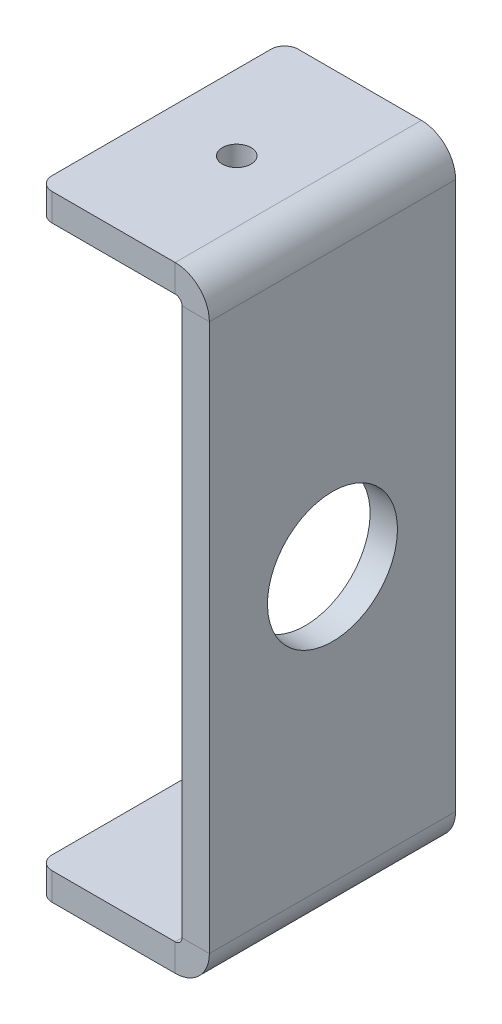
ISO-10303-21;
HEADER;
FILE_DESCRIPTION(('STEP AP214'),'2;1');
FILE_NAME('part.step','',(''),(''),'','','');
FILE_SCHEMA(('AUTOMOTIVE_DESIGN { 1 0 10303 214 1 1 1 1 }'));
ENDSEC;
DATA;
#1=APPLICATION_CONTEXT('core data for automotive mechanical design processes');
#2=APPLICATION_PROTOCOL_DEFINITION('international standard','automotive_design',2000,#1);
#3=PRODUCT_CONTEXT('',#1,'mechanical');
#4=PRODUCT('Part','Part','',(#3));
#5=PRODUCT_RELATED_PRODUCT_CATEGORY('part','',(#4));
#6=PRODUCT_DEFINITION_FORMATION('','',#4);
#7=PRODUCT_DEFINITION_CONTEXT('part definition',#1,'design');
#8=PRODUCT_DEFINITION('design','',#6,#7);
#9=PRODUCT_DEFINITION_SHAPE('','',#8);
#10=(LENGTH_UNIT() NAMED_UNIT(*) SI_UNIT(.MILLI.,.METRE.));
#11=(NAMED_UNIT(*) PLANE_ANGLE_UNIT() SI_UNIT($,.RADIAN.));
#12=(NAMED_UNIT(*) SI_UNIT($,.STERADIAN.) SOLID_ANGLE_UNIT());
#13=UNCERTAINTY_MEASURE_WITH_UNIT(LENGTH_MEASURE(1.E-05),#10,'distance_accuracy_value','');
#14=(GEOMETRIC_REPRESENTATION_CONTEXT(3) GLOBAL_UNCERTAINTY_ASSIGNED_CONTEXT((#13)) GLOBAL_UNIT_ASSIGNED_CONTEXT((#10,
#11,#12)) REPRESENTATION_CONTEXT('',''));
#15=CARTESIAN_POINT('',(0.,0.,0.));
#16=DIRECTION('',(0.,0.,1.));
#17=DIRECTION('',(1.,0.,0.));
#18=AXIS2_PLACEMENT_3D('',#15,#16,#17);
#19=CARTESIAN_POINT('',(0.,-45.,18.));
#20=DIRECTION('',(0.,1.,0.));
#21=DIRECTION('',(0.,0.,1.));
#22=AXIS2_PLACEMENT_3D('',#19,#20,#21);
#23=PLANE('',#22);
#24=DIRECTION('',(0.,0.,-1.));
#25=VECTOR('',#24,1.);
#26=CARTESIAN_POINT('',(-25.,-45.,18.));
#27=LINE('',#26,#25);
#28=CARTESIAN_POINT('',(-25.,-45.,16.));
#29=VERTEX_POINT('',#28);
#30=CARTESIAN_POINT('',(-25.,-45.,-16.));
#31=VERTEX_POINT('',#30);
#32=EDGE_CURVE('E244',#29,#31,#27,.T.);
#33=ORIENTED_EDGE('',*,*,#32,.T.);
#34=CARTESIAN_POINT('',(-23.,-45.,-16.));
#35=DIRECTION('',(0.,1.,0.));
#36=DIRECTION('',(0.,0.,1.));
#37=AXIS2_PLACEMENT_3D('',#34,#35,#36);
#38=CIRCLE('',#37,2.);
#39=CARTESIAN_POINT('',(-23.,-45.,-18.));
#40=VERTEX_POINT('',#39);
#41=EDGE_CURVE('E288',#31,#40,#38,.F.);
#42=ORIENTED_EDGE('',*,*,#41,.T.);
#43=DIRECTION('',(1.,0.,0.));
#44=VECTOR('',#43,1.);
#45=CARTESIAN_POINT('',(0.,-45.,-18.));
#46=LINE('',#45,#44);
#47=CARTESIAN_POINT('',(-4.99999999999999,-45.,-18.));
#48=VERTEX_POINT('',#47);
#49=EDGE_CURVE('E222',#40,#48,#46,.T.);
#50=ORIENTED_EDGE('',*,*,#49,.T.);
#51=DIRECTION('',(0.,0.,-1.));
#52=VECTOR('',#51,1.);
#53=CARTESIAN_POINT('',(-4.99999999999999,-45.,18.));
#54=LINE('',#53,#52);
#55=CARTESIAN_POINT('',(-4.99999999999999,-45.,18.));
#56=VERTEX_POINT('',#55);
#57=EDGE_CURVE('E241',#56,#48,#54,.T.);
#58=ORIENTED_EDGE('',*,*,#57,.F.);
#59=DIRECTION('',(1.,0.,0.));
#60=VECTOR('',#59,1.);
#61=CARTESIAN_POINT('',(0.,-45.,18.));
#62=LINE('',#61,#60);
#63=CARTESIAN_POINT('',(-23.,-45.,18.));
#64=VERTEX_POINT('',#63);
#65=EDGE_CURVE('E197',#64,#56,#62,.T.);
#66=ORIENTED_EDGE('',*,*,#65,.F.);
#67=CARTESIAN_POINT('',(-23.,-45.,16.));
#68=DIRECTION('',(0.,1.,0.));
#69=DIRECTION('',(0.,0.,1.));
#70=AXIS2_PLACEMENT_3D('',#67,#68,#69);
#71=CIRCLE('',#70,2.);
#72=EDGE_CURVE('E286',#64,#29,#71,.F.);
#73=ORIENTED_EDGE('',*,*,#72,.T.);
#74=EDGE_LOOP('',(#33,#42,#50,#58,#66,#73));
#75=FACE_BOUND('',#74,.T.);
#76=CARTESIAN_POINT('',(-14.,-45.,0.));
#77=DIRECTION('',(0.,-1.,0.));
#78=DIRECTION('',(0.,0.,-1.));
#79=AXIS2_PLACEMENT_3D('',#76,#77,#78);
#80=CIRCLE('',#79,2.1);
#81=CARTESIAN_POINT('',(-14.,-45.,-2.1));
#82=VERTEX_POINT('',#81);
#83=EDGE_CURVE('E328',#82,#82,#80,.T.);
#84=ORIENTED_EDGE('',*,*,#83,.F.);
#85=EDGE_LOOP('',(#84));
#86=FACE_BOUND('',#85,.T.);
#87=ADVANCED_FACE('F39',(#75,#86),#23,.F.);
#88=CARTESIAN_POINT('',(0.,45.,18.));
#89=DIRECTION('',(0.,-1.,0.));
#90=DIRECTION('',(0.,0.,-1.));
#91=AXIS2_PLACEMENT_3D('',#88,#89,#90);
#92=PLANE('',#91);
#93=DIRECTION('',(-1.,0.,0.));
#94=VECTOR('',#93,1.);
#95=CARTESIAN_POINT('',(0.,45.,-18.));
#96=LINE('',#95,#94);
#97=CARTESIAN_POINT('',(-4.99999999999999,45.,-18.));
#98=VERTEX_POINT('',#97);
#99=CARTESIAN_POINT('',(-23.,45.,-18.));
#100=VERTEX_POINT('',#99);
#101=EDGE_CURVE('E207',#98,#100,#96,.T.);
#102=ORIENTED_EDGE('',*,*,#101,.T.);
#103=CARTESIAN_POINT('',(-23.,45.,-16.));
#104=DIRECTION('',(0.,-1.,0.));
#105=DIRECTION('',(0.,0.,-1.));
#106=AXIS2_PLACEMENT_3D('',#103,#104,#105);
#107=CIRCLE('',#106,2.);
#108=CARTESIAN_POINT('',(-25.,45.,-16.));
#109=VERTEX_POINT('',#108);
#110=EDGE_CURVE('E297',#100,#109,#107,.F.);
#111=ORIENTED_EDGE('',*,*,#110,.T.);
#112=DIRECTION('',(0.,0.,-1.));
#113=VECTOR('',#112,1.);
#114=CARTESIAN_POINT('',(-25.,45.,18.));
#115=LINE('',#114,#113);
#116=CARTESIAN_POINT('',(-25.,45.,16.));
#117=VERTEX_POINT('',#116);
#118=EDGE_CURVE('E258',#117,#109,#115,.T.);
#119=ORIENTED_EDGE('',*,*,#118,.F.);
#120=CARTESIAN_POINT('',(-23.,45.,16.));
#121=DIRECTION('',(0.,-1.,0.));
#122=DIRECTION('',(0.,0.,-1.));
#123=AXIS2_PLACEMENT_3D('',#120,#121,#122);
#124=CIRCLE('',#123,2.);
#125=CARTESIAN_POINT('',(-23.,45.,18.));
#126=VERTEX_POINT('',#125);
#127=EDGE_CURVE('E295',#117,#126,#124,.F.);
#128=ORIENTED_EDGE('',*,*,#127,.T.);
#129=DIRECTION('',(-1.,0.,0.));
#130=VECTOR('',#129,1.);
#131=CARTESIAN_POINT('',(0.,45.,18.));
#132=LINE('',#131,#130);
#133=CARTESIAN_POINT('',(-4.99999999999999,45.,18.));
#134=VERTEX_POINT('',#133);
#135=EDGE_CURVE('E182',#134,#126,#132,.T.);
#136=ORIENTED_EDGE('',*,*,#135,.F.);
#137=DIRECTION('',(0.,0.,-1.));
#138=VECTOR('',#137,1.);
#139=CARTESIAN_POINT('',(-4.99999999999999,45.,18.));
#140=LINE('',#139,#138);
#141=EDGE_CURVE('E206',#134,#98,#140,.T.);
#142=ORIENTED_EDGE('',*,*,#141,.T.);
#143=EDGE_LOOP('',(#102,#111,#119,#128,#136,#142));
#144=FACE_BOUND('',#143,.T.);
#145=CARTESIAN_POINT('',(-14.,45.,0.));
#146=DIRECTION('',(0.,1.,0.));
#147=DIRECTION('',(0.,0.,1.));
#148=AXIS2_PLACEMENT_3D('',#145,#146,#147);
#149=CIRCLE('',#148,2.1);
#150=CARTESIAN_POINT('',(-14.,45.,2.1));
#151=VERTEX_POINT('',#150);
#152=EDGE_CURVE('E322',#151,#151,#149,.T.);
#153=ORIENTED_EDGE('',*,*,#152,.F.);
#154=EDGE_LOOP('',(#153));
#155=FACE_BOUND('',#154,.T.);
#156=ADVANCED_FACE('F313',(#144,#155),#92,.F.);
#157=CARTESIAN_POINT('',(-4.99999999999999,-45.,18.));
#158=DIRECTION('',(0.,0.,1.));
#159=DIRECTION('',(1.,0.,0.));
#160=AXIS2_PLACEMENT_3D('',#157,#158,#159);
#161=PLANE('',#160);
#162=DIRECTION('',(0.,1.,0.));
#163=VECTOR('',#162,1.);
#164=CARTESIAN_POINT('',(-4.99999999999999,-45.,18.));
#165=LINE('',#164,#163);
#166=CARTESIAN_POINT('',(-4.99999999999999,-41.,18.));
#167=VERTEX_POINT('',#166);
#168=EDGE_CURVE('E271',#56,#167,#165,.T.);
#169=ORIENTED_EDGE('',*,*,#168,.F.);
#170=CARTESIAN_POINT('',(-4.99999999999999,-40.,18.));
#171=DIRECTION('',(0.,0.,-1.));
#172=DIRECTION('',(-1.,0.,0.));
#173=AXIS2_PLACEMENT_3D('',#170,#171,#172);
#174=CIRCLE('',#173,5.);
#175=CARTESIAN_POINT('',(0.,-39.9999999999999,18.));
#176=VERTEX_POINT('',#175);
#177=EDGE_CURVE('E199',#56,#176,#174,.F.);
#178=ORIENTED_EDGE('',*,*,#177,.T.);
#179=DIRECTION('',(1.,0.,0.));
#180=VECTOR('',#179,1.);
#181=CARTESIAN_POINT('',(-3.99999999999999,-39.9999999999999,18.));
#182=LINE('',#181,#180);
#183=CARTESIAN_POINT('',(-3.99999999999999,-39.9999999999999,18.));
#184=VERTEX_POINT('',#183);
#185=EDGE_CURVE('E269',#184,#176,#182,.T.);
#186=ORIENTED_EDGE('',*,*,#185,.F.);
#187=CARTESIAN_POINT('',(-4.99999999999999,-40.,18.));
#188=DIRECTION('',(0.,0.,1.));
#189=DIRECTION('',(1.,0.,0.));
#190=AXIS2_PLACEMENT_3D('',#187,#188,#189);
#191=CIRCLE('',#190,1.);
#192=EDGE_CURVE('E189',#167,#184,#191,.T.);
#193=ORIENTED_EDGE('',*,*,#192,.F.);
#194=EDGE_LOOP('',(#169,#178,#186,#193));
#195=FACE_BOUND('',#194,.T.);
#196=ADVANCED_FACE('F372',(#195),#161,.T.);
#197=CARTESIAN_POINT('',(-3.99999999999999,-39.9999999999999,18.));
#198=DIRECTION('',(0.,0.,1.));
#199=DIRECTION('',(1.,0.,0.));
#200=AXIS2_PLACEMENT_3D('',#197,#198,#199);
#201=PLANE('',#200);
#202=DIRECTION('',(1.,0.,0.));
#203=VECTOR('',#202,1.);
#204=CARTESIAN_POINT('',(0.,-41.,18.));
#205=LINE('',#204,#203);
#206=CARTESIAN_POINT('',(-23.,-41.,18.));
#207=VERTEX_POINT('',#206);
#208=EDGE_CURVE('E195',#207,#167,#205,.T.);
#209=ORIENTED_EDGE('',*,*,#208,.F.);
#210=DIRECTION('',(0.,1.,0.));
#211=VECTOR('',#210,1.);
#212=CARTESIAN_POINT('',(-23.,-39.9999999999999,18.));
#213=LINE('',#212,#211);
#214=EDGE_CURVE('E290',#207,#64,#213,.F.);
#215=ORIENTED_EDGE('',*,*,#214,.T.);
#216=ORIENTED_EDGE('',*,*,#65,.T.);
#217=ORIENTED_EDGE('',*,*,#168,.T.);
#218=EDGE_LOOP('',(#209,#215,#216,#217));
#219=FACE_BOUND('',#218,.T.);
#220=ADVANCED_FACE('F650',(#219),#201,.T.);
#221=CARTESIAN_POINT('',(0.,-39.9999999999999,-18.));
#222=DIRECTION('',(0.,0.,-1.));
#223=DIRECTION('',(-1.,0.,0.));
#224=AXIS2_PLACEMENT_3D('',#221,#222,#223);
#225=PLANE('',#224);
#226=DIRECTION('',(-1.,0.,0.));
#227=VECTOR('',#226,1.);
#228=CARTESIAN_POINT('',(0.,-39.9999999999999,-18.));
#229=LINE('',#228,#227);
#230=CARTESIAN_POINT('',(0.,-39.9999999999999,-18.));
#231=VERTEX_POINT('',#230);
#232=CARTESIAN_POINT('',(-3.99999999999999,-39.9999999999999,-18.));
#233=VERTEX_POINT('',#232);
#234=EDGE_CURVE('E267',#231,#233,#229,.T.);
#235=ORIENTED_EDGE('',*,*,#234,.F.);
#236=CARTESIAN_POINT('',(-4.99999999999999,-40.,-18.));
#237=DIRECTION('',(0.,0.,-1.));
#238=DIRECTION('',(-1.,0.,0.));
#239=AXIS2_PLACEMENT_3D('',#236,#237,#238);
#240=CIRCLE('',#239,5.);
#241=EDGE_CURVE('E224',#48,#231,#240,.F.);
#242=ORIENTED_EDGE('',*,*,#241,.F.);
#243=DIRECTION('',(0.,-1.,0.));
#244=VECTOR('',#243,1.);
#245=CARTESIAN_POINT('',(-4.99999999999999,-41.,-18.));
#246=LINE('',#245,#244);
#247=CARTESIAN_POINT('',(-4.99999999999999,-41.,-18.));
#248=VERTEX_POINT('',#247);
#249=EDGE_CURVE('E264',#248,#48,#246,.T.);
#250=ORIENTED_EDGE('',*,*,#249,.F.);
#251=CARTESIAN_POINT('',(-4.99999999999999,-40.,-18.));
#252=DIRECTION('',(0.,0.,1.));
#253=DIRECTION('',(1.,0.,0.));
#254=AXIS2_PLACEMENT_3D('',#251,#252,#253);
#255=CIRCLE('',#254,1.);
#256=EDGE_CURVE('E217',#248,#233,#255,.T.);
#257=ORIENTED_EDGE('',*,*,#256,.T.);
#258=EDGE_LOOP('',(#235,#242,#250,#257));
#259=FACE_BOUND('',#258,.T.);
#260=ADVANCED_FACE('F364',(#259),#225,.T.);
#261=CARTESIAN_POINT('',(-4.99999999999999,-41.,-18.));
#262=DIRECTION('',(0.,0.,-1.));
#263=DIRECTION('',(-1.,0.,0.));
#264=AXIS2_PLACEMENT_3D('',#261,#262,#263);
#265=PLANE('',#264);
#266=DIRECTION('',(0.,1.,0.));
#267=VECTOR('',#266,1.);
#268=CARTESIAN_POINT('',(0.,45.,-18.));
#269=LINE('',#268,#267);
#270=CARTESIAN_POINT('',(0.,40.,-18.));
#271=VERTEX_POINT('',#270);
#272=EDGE_CURVE('E227',#231,#271,#269,.T.);
#273=ORIENTED_EDGE('',*,*,#272,.F.);
#274=ORIENTED_EDGE('',*,*,#234,.T.);
#275=DIRECTION('',(0.,1.,0.));
#276=VECTOR('',#275,1.);
#277=CARTESIAN_POINT('',(-3.99999999999999,45.,-18.));
#278=LINE('',#277,#276);
#279=CARTESIAN_POINT('',(-3.99999999999999,40.,-18.));
#280=VERTEX_POINT('',#279);
#281=EDGE_CURVE('E214',#233,#280,#278,.T.);
#282=ORIENTED_EDGE('',*,*,#281,.T.);
#283=DIRECTION('',(1.,0.,0.));
#284=VECTOR('',#283,1.);
#285=CARTESIAN_POINT('',(-3.99999999999999,40.,-18.));
#286=LINE('',#285,#284);
#287=EDGE_CURVE('E260',#280,#271,#286,.T.);
#288=ORIENTED_EDGE('',*,*,#287,.T.);
#289=EDGE_LOOP('',(#273,#274,#282,#288));
#290=FACE_BOUND('',#289,.T.);
#291=ADVANCED_FACE('F356',(#290),#265,.T.);
#292=CARTESIAN_POINT('',(0.,40.,18.));
#293=DIRECTION('',(0.,0.,1.));
#294=DIRECTION('',(1.,0.,0.));
#295=AXIS2_PLACEMENT_3D('',#292,#293,#294);
#296=PLANE('',#295);
#297=DIRECTION('',(-1.,0.,0.));
#298=VECTOR('',#297,1.);
#299=CARTESIAN_POINT('',(0.,40.,18.));
#300=LINE('',#299,#298);
#301=CARTESIAN_POINT('',(0.,40.,18.));
#302=VERTEX_POINT('',#301);
#303=CARTESIAN_POINT('',(-3.99999999999999,40.,18.));
#304=VERTEX_POINT('',#303);
#305=EDGE_CURVE('E163',#302,#304,#300,.T.);
#306=ORIENTED_EDGE('',*,*,#305,.F.);
#307=CARTESIAN_POINT('',(-4.99999999999999,40.,18.));
#308=DIRECTION('',(0.,0.,-1.));
#309=DIRECTION('',(-1.,0.,0.));
#310=AXIS2_PLACEMENT_3D('',#307,#308,#309);
#311=CIRCLE('',#310,5.);
#312=EDGE_CURVE('E161',#302,#134,#311,.F.);
#313=ORIENTED_EDGE('',*,*,#312,.T.);
#314=DIRECTION('',(0.,1.,0.));
#315=VECTOR('',#314,1.);
#316=CARTESIAN_POINT('',(-4.99999999999999,41.,18.));
#317=LINE('',#316,#315);
#318=CARTESIAN_POINT('',(-4.99999999999999,41.,18.));
#319=VERTEX_POINT('',#318);
#320=EDGE_CURVE('E154',#319,#134,#317,.T.);
#321=ORIENTED_EDGE('',*,*,#320,.F.);
#322=CARTESIAN_POINT('',(-4.99999999999999,40.,18.));
#323=DIRECTION('',(0.,0.,1.));
#324=DIRECTION('',(1.,0.,0.));
#325=AXIS2_PLACEMENT_3D('',#322,#323,#324);
#326=CIRCLE('',#325,1.);
#327=EDGE_CURVE('E158',#304,#319,#326,.T.);
#328=ORIENTED_EDGE('',*,*,#327,.F.);
#329=EDGE_LOOP('',(#306,#313,#321,#328));
#330=FACE_BOUND('',#329,.T.);
#331=ADVANCED_FACE('F156',(#330),#296,.T.);
#332=CARTESIAN_POINT('',(-4.99999999999999,41.,18.));
#333=DIRECTION('',(0.,0.,1.));
#334=DIRECTION('',(1.,0.,0.));
#335=AXIS2_PLACEMENT_3D('',#332,#333,#334);
#336=PLANE('',#335);
#337=DIRECTION('',(0.,1.,0.));
#338=VECTOR('',#337,1.);
#339=CARTESIAN_POINT('',(0.,45.,18.));
#340=LINE('',#339,#338);
#341=EDGE_CURVE('E202',#176,#302,#340,.T.);
#342=ORIENTED_EDGE('',*,*,#341,.T.);
#343=ORIENTED_EDGE('',*,*,#305,.T.);
#344=DIRECTION('',(0.,1.,0.));
#345=VECTOR('',#344,1.);
#346=CARTESIAN_POINT('',(-3.99999999999999,45.,18.));
#347=LINE('',#346,#345);
#348=EDGE_CURVE('E187',#184,#304,#347,.T.);
#349=ORIENTED_EDGE('',*,*,#348,.F.);
#350=ORIENTED_EDGE('',*,*,#185,.T.);
#351=EDGE_LOOP('',(#342,#343,#349,#350));
#352=FACE_BOUND('',#351,.T.);
#353=ADVANCED_FACE('F376',(#352),#336,.T.);
#354=CARTESIAN_POINT('',(-4.99999999999999,45.,-18.));
#355=DIRECTION('',(0.,0.,-1.));
#356=DIRECTION('',(-1.,0.,0.));
#357=AXIS2_PLACEMENT_3D('',#354,#355,#356);
#358=PLANE('',#357);
#359=DIRECTION('',(0.,-1.,0.));
#360=VECTOR('',#359,1.);
#361=CARTESIAN_POINT('',(-4.99999999999999,45.,-18.));
#362=LINE('',#361,#360);
#363=CARTESIAN_POINT('',(-4.99999999999999,41.,-18.));
#364=VERTEX_POINT('',#363);
#365=EDGE_CURVE('E164',#98,#364,#362,.T.);
#366=ORIENTED_EDGE('',*,*,#365,.F.);
#367=CARTESIAN_POINT('',(-4.99999999999999,40.,-18.));
#368=DIRECTION('',(0.,0.,-1.));
#369=DIRECTION('',(-1.,0.,0.));
#370=AXIS2_PLACEMENT_3D('',#367,#368,#369);
#371=CIRCLE('',#370,5.);
#372=EDGE_CURVE('E230',#271,#98,#371,.F.);
#373=ORIENTED_EDGE('',*,*,#372,.F.);
#374=ORIENTED_EDGE('',*,*,#287,.F.);
#375=CARTESIAN_POINT('',(-4.99999999999999,40.,-18.));
#376=DIRECTION('',(0.,0.,1.));
#377=DIRECTION('',(1.,0.,0.));
#378=AXIS2_PLACEMENT_3D('',#375,#376,#377);
#379=CIRCLE('',#378,1.);
#380=EDGE_CURVE('E212',#280,#364,#379,.T.);
#381=ORIENTED_EDGE('',*,*,#380,.T.);
#382=EDGE_LOOP('',(#366,#373,#374,#381));
#383=FACE_BOUND('',#382,.T.);
#384=ADVANCED_FACE('F354',(#383),#358,.T.);
#385=CARTESIAN_POINT('',(-3.99999999999999,40.,-18.));
#386=DIRECTION('',(0.,0.,-1.));
#387=DIRECTION('',(-1.,0.,0.));
#388=AXIS2_PLACEMENT_3D('',#385,#386,#387);
#389=PLANE('',#388);
#390=DIRECTION('',(1.,0.,0.));
#391=VECTOR('',#390,1.);
#392=CARTESIAN_POINT('',(0.,41.,-18.));
#393=LINE('',#392,#391);
#394=CARTESIAN_POINT('',(-23.,41.,-18.));
#395=VERTEX_POINT('',#394);
#396=EDGE_CURVE('E174',#364,#395,#393,.F.);
#397=ORIENTED_EDGE('',*,*,#396,.T.);
#398=DIRECTION('',(0.,1.,0.));
#399=VECTOR('',#398,1.);
#400=CARTESIAN_POINT('',(-23.,40.,-18.));
#401=LINE('',#400,#399);
#402=EDGE_CURVE('E292',#395,#100,#401,.T.);
#403=ORIENTED_EDGE('',*,*,#402,.T.);
#404=ORIENTED_EDGE('',*,*,#101,.F.);
#405=ORIENTED_EDGE('',*,*,#365,.T.);
#406=EDGE_LOOP('',(#397,#403,#404,#405));
#407=FACE_BOUND('',#406,.T.);
#408=ADVANCED_FACE('F308',(#407),#389,.T.);
#409=CARTESIAN_POINT('',(-25.,41.,18.));
#410=DIRECTION('',(-1.,0.,0.));
#411=DIRECTION('',(0.,0.,1.));
#412=AXIS2_PLACEMENT_3D('',#409,#410,#411);
#413=PLANE('',#412);
#414=ORIENTED_EDGE('',*,*,#118,.T.);
#415=DIRECTION('',(0.,1.,0.));
#416=VECTOR('',#415,1.);
#417=CARTESIAN_POINT('',(-25.,41.,-16.));
#418=LINE('',#417,#416);
#419=CARTESIAN_POINT('',(-25.,41.,-16.));
#420=VERTEX_POINT('',#419);
#421=EDGE_CURVE('E60',#109,#420,#418,.F.);
#422=ORIENTED_EDGE('',*,*,#421,.T.);
#423=DIRECTION('',(0.,0.,-1.));
#424=VECTOR('',#423,1.);
#425=CARTESIAN_POINT('',(-25.,41.,18.));
#426=LINE('',#425,#424);
#427=CARTESIAN_POINT('',(-25.,41.,16.));
#428=VERTEX_POINT('',#427);
#429=EDGE_CURVE('E178',#428,#420,#426,.T.);
#430=ORIENTED_EDGE('',*,*,#429,.F.);
#431=DIRECTION('',(0.,1.,0.));
#432=VECTOR('',#431,1.);
#433=CARTESIAN_POINT('',(-25.,41.,16.));
#434=LINE('',#433,#432);
#435=EDGE_CURVE('E299',#428,#117,#434,.T.);
#436=ORIENTED_EDGE('',*,*,#435,.T.);
#437=EDGE_LOOP('',(#414,#422,#430,#436));
#438=FACE_BOUND('',#437,.T.);
#439=ADVANCED_FACE('F315',(#438),#413,.T.);
#440=CARTESIAN_POINT('',(0.,41.,18.));
#441=DIRECTION('',(0.,-1.,0.));
#442=DIRECTION('',(0.,0.,-1.));
#443=AXIS2_PLACEMENT_3D('',#440,#441,#442);
#444=PLANE('',#443);
#445=CARTESIAN_POINT('',(-14.,41.,0.));
#446=DIRECTION('',(0.,-1.,0.));
#447=DIRECTION('',(0.,0.,-1.));
#448=AXIS2_PLACEMENT_3D('',#445,#446,#447);
#449=CIRCLE('',#448,2.1);
#450=CARTESIAN_POINT('',(-14.,41.,-2.1));
#451=VERTEX_POINT('',#450);
#452=EDGE_CURVE('E210',#451,#451,#449,.T.);
#453=ORIENTED_EDGE('',*,*,#452,.F.);
#454=EDGE_LOOP('',(#453));
#455=FACE_BOUND('',#454,.T.);
#456=ORIENTED_EDGE('',*,*,#429,.T.);
#457=CARTESIAN_POINT('',(-23.,41.,-16.));
#458=DIRECTION('',(0.,-1.,0.));
#459=DIRECTION('',(0.,0.,-1.));
#460=AXIS2_PLACEMENT_3D('',#457,#458,#459);
#461=CIRCLE('',#460,2.);
#462=EDGE_CURVE('E47',#420,#395,#461,.T.);
#463=ORIENTED_EDGE('',*,*,#462,.T.);
#464=ORIENTED_EDGE('',*,*,#396,.F.);
#465=DIRECTION('',(0.,0.,-1.));
#466=VECTOR('',#465,1.);
#467=CARTESIAN_POINT('',(-4.99999999999999,41.,18.));
#468=LINE('',#467,#466);
#469=EDGE_CURVE('E169',#319,#364,#468,.T.);
#470=ORIENTED_EDGE('',*,*,#469,.F.);
#471=DIRECTION('',(1.,0.,0.));
#472=VECTOR('',#471,1.);
#473=CARTESIAN_POINT('',(0.,41.,18.));
#474=LINE('',#473,#472);
#475=CARTESIAN_POINT('',(-23.,41.,18.));
#476=VERTEX_POINT('',#475);
#477=EDGE_CURVE('E171',#319,#476,#474,.F.);
#478=ORIENTED_EDGE('',*,*,#477,.T.);
#479=CARTESIAN_POINT('',(-23.,41.,16.));
#480=DIRECTION('',(0.,-1.,0.));
#481=DIRECTION('',(0.,0.,-1.));
#482=AXIS2_PLACEMENT_3D('',#479,#480,#481);
#483=CIRCLE('',#482,2.);
#484=EDGE_CURVE('E303',#476,#428,#483,.T.);
#485=ORIENTED_EDGE('',*,*,#484,.T.);
#486=EDGE_LOOP('',(#456,#463,#464,#470,#478,#485));
#487=FACE_BOUND('',#486,.T.);
#488=ADVANCED_FACE('F170',(#455,#487),#444,.T.);
#489=CARTESIAN_POINT('',(-4.99999999999999,40.,18.));
#490=DIRECTION('',(0.,0.,-1.));
#491=DIRECTION('',(-1.,0.,0.));
#492=AXIS2_PLACEMENT_3D('',#489,#490,#491);
#493=CYLINDRICAL_SURFACE('',#492,1.);
#494=ORIENTED_EDGE('',*,*,#380,.F.);
#495=DIRECTION('',(0.,0.,-1.));
#496=VECTOR('',#495,1.);
#497=CARTESIAN_POINT('',(-3.99999999999999,40.,18.));
#498=LINE('',#497,#496);
#499=EDGE_CURVE('E179',#304,#280,#498,.T.);
#500=ORIENTED_EDGE('',*,*,#499,.F.);
#501=ORIENTED_EDGE('',*,*,#327,.T.);
#502=ORIENTED_EDGE('',*,*,#469,.T.);
#503=EDGE_LOOP('',(#494,#500,#501,#502));
#504=FACE_BOUND('',#503,.T.);
#505=ADVANCED_FACE('F185',(#504),#493,.F.);
#506=CARTESIAN_POINT('',(-3.99999999999999,45.,18.));
#507=DIRECTION('',(-1.,0.,0.));
#508=DIRECTION('',(0.,0.,1.));
#509=AXIS2_PLACEMENT_3D('',#506,#507,#508);
#510=PLANE('',#509);
#511=CARTESIAN_POINT('',(-3.99999999999999,0.,0.));
#512=DIRECTION('',(-1.,0.,0.));
#513=DIRECTION('',(0.,0.,1.));
#514=AXIS2_PLACEMENT_3D('',#511,#512,#513);
#515=CIRCLE('',#514,9.5);
#516=CARTESIAN_POINT('',(-3.99999999999999,0.,9.5));
#517=VERTEX_POINT('',#516);
#518=EDGE_CURVE('E331',#517,#517,#515,.T.);
#519=ORIENTED_EDGE('',*,*,#518,.F.);
#520=EDGE_LOOP('',(#519));
#521=FACE_BOUND('',#520,.T.);
#522=ORIENTED_EDGE('',*,*,#281,.F.);
#523=DIRECTION('',(0.,0.,-1.));
#524=VECTOR('',#523,1.);
#525=CARTESIAN_POINT('',(-3.99999999999999,-39.9999999999999,18.));
#526=LINE('',#525,#524);
#527=EDGE_CURVE('E253',#184,#233,#526,.T.);
#528=ORIENTED_EDGE('',*,*,#527,.F.);
#529=ORIENTED_EDGE('',*,*,#348,.T.);
#530=ORIENTED_EDGE('',*,*,#499,.T.);
#531=EDGE_LOOP('',(#522,#528,#529,#530));
#532=FACE_BOUND('',#531,.T.);
#533=ADVANCED_FACE('F359',(#521,#532),#510,.T.);
#534=CARTESIAN_POINT('',(-4.99999999999999,-40.,18.));
#535=DIRECTION('',(0.,0.,-1.));
#536=DIRECTION('',(-1.,0.,0.));
#537=AXIS2_PLACEMENT_3D('',#534,#535,#536);
#538=CYLINDRICAL_SURFACE('',#537,1.);
#539=ORIENTED_EDGE('',*,*,#256,.F.);
#540=DIRECTION('',(0.,0.,-1.));
#541=VECTOR('',#540,1.);
#542=CARTESIAN_POINT('',(-4.99999999999999,-41.,18.));
#543=LINE('',#542,#541);
#544=EDGE_CURVE('E250',#167,#248,#543,.T.);
#545=ORIENTED_EDGE('',*,*,#544,.F.);
#546=ORIENTED_EDGE('',*,*,#192,.T.);
#547=ORIENTED_EDGE('',*,*,#527,.T.);
#548=EDGE_LOOP('',(#539,#545,#546,#547));
#549=FACE_BOUND('',#548,.T.);
#550=ADVANCED_FACE('F368',(#549),#538,.F.);
#551=CARTESIAN_POINT('',(0.,-41.,18.));
#552=DIRECTION('',(0.,1.,0.));
#553=DIRECTION('',(0.,0.,1.));
#554=AXIS2_PLACEMENT_3D('',#551,#552,#553);
#555=PLANE('',#554);
#556=CARTESIAN_POINT('',(-14.,-41.,0.));
#557=DIRECTION('',(0.,1.,0.));
#558=DIRECTION('',(0.,0.,1.));
#559=AXIS2_PLACEMENT_3D('',#556,#557,#558);
#560=CIRCLE('',#559,2.1);
#561=CARTESIAN_POINT('',(-14.,-41.,2.1));
#562=VERTEX_POINT('',#561);
#563=EDGE_CURVE('E325',#562,#562,#560,.T.);
#564=ORIENTED_EDGE('',*,*,#563,.F.);
#565=EDGE_LOOP('',(#564));
#566=FACE_BOUND('',#565,.T.);
#567=DIRECTION('',(1.,0.,0.));
#568=VECTOR('',#567,1.);
#569=CARTESIAN_POINT('',(0.,-41.,-18.));
#570=LINE('',#569,#568);
#571=CARTESIAN_POINT('',(-23.,-41.,-18.));
#572=VERTEX_POINT('',#571);
#573=EDGE_CURVE('E220',#572,#248,#570,.T.);
#574=ORIENTED_EDGE('',*,*,#573,.F.);
#575=CARTESIAN_POINT('',(-23.,-41.,-16.));
#576=DIRECTION('',(0.,1.,0.));
#577=DIRECTION('',(0.,0.,1.));
#578=AXIS2_PLACEMENT_3D('',#575,#576,#577);
#579=CIRCLE('',#578,2.);
#580=CARTESIAN_POINT('',(-25.,-41.,-16.));
#581=VERTEX_POINT('',#580);
#582=EDGE_CURVE('E279',#572,#581,#579,.T.);
#583=ORIENTED_EDGE('',*,*,#582,.T.);
#584=DIRECTION('',(0.,0.,-1.));
#585=VECTOR('',#584,1.);
#586=CARTESIAN_POINT('',(-25.,-41.,18.));
#587=LINE('',#586,#585);
#588=CARTESIAN_POINT('',(-25.,-41.,16.));
#589=VERTEX_POINT('',#588);
#590=EDGE_CURVE('E247',#589,#581,#587,.T.);
#591=ORIENTED_EDGE('',*,*,#590,.F.);
#592=CARTESIAN_POINT('',(-23.,-41.,16.));
#593=DIRECTION('',(0.,1.,0.));
#594=DIRECTION('',(0.,0.,1.));
#595=AXIS2_PLACEMENT_3D('',#592,#593,#594);
#596=CIRCLE('',#595,2.);
#597=EDGE_CURVE('E277',#589,#207,#596,.T.);
#598=ORIENTED_EDGE('',*,*,#597,.T.);
#599=ORIENTED_EDGE('',*,*,#208,.T.);
#600=ORIENTED_EDGE('',*,*,#544,.T.);
#601=EDGE_LOOP('',(#574,#583,#591,#598,#599,#600));
#602=FACE_BOUND('',#601,.T.);
#603=ADVANCED_FACE('F398',(#566,#602),#555,.T.);
#604=CARTESIAN_POINT('',(-25.,-45.,18.));
#605=DIRECTION('',(-1.,0.,0.));
#606=DIRECTION('',(0.,0.,1.));
#607=AXIS2_PLACEMENT_3D('',#604,#605,#606);
#608=PLANE('',#607);
#609=ORIENTED_EDGE('',*,*,#590,.T.);
#610=DIRECTION('',(0.,1.,0.));
#611=VECTOR('',#610,1.);
#612=CARTESIAN_POINT('',(-25.,-45.,-16.));
#613=LINE('',#612,#611);
#614=EDGE_CURVE('E284',#581,#31,#613,.F.);
#615=ORIENTED_EDGE('',*,*,#614,.T.);
#616=ORIENTED_EDGE('',*,*,#32,.F.);
#617=DIRECTION('',(0.,1.,0.));
#618=VECTOR('',#617,1.);
#619=CARTESIAN_POINT('',(-25.,-45.,16.));
#620=LINE('',#619,#618);
#621=EDGE_CURVE('E281',#29,#589,#620,.T.);
#622=ORIENTED_EDGE('',*,*,#621,.T.);
#623=EDGE_LOOP('',(#609,#615,#616,#622));
#624=FACE_BOUND('',#623,.T.);
#625=ADVANCED_FACE('F395',(#624),#608,.T.);
#626=CARTESIAN_POINT('',(-4.99999999999999,-40.,18.));
#627=DIRECTION('',(0.,0.,-1.));
#628=DIRECTION('',(-1.,0.,0.));
#629=AXIS2_PLACEMENT_3D('',#626,#627,#628);
#630=CYLINDRICAL_SURFACE('',#629,5.);
#631=ORIENTED_EDGE('',*,*,#241,.T.);
#632=DIRECTION('',(0.,0.,-1.));
#633=VECTOR('',#632,1.);
#634=CARTESIAN_POINT('',(0.,-39.9999999999999,18.));
#635=LINE('',#634,#633);
#636=EDGE_CURVE('E238',#176,#231,#635,.T.);
#637=ORIENTED_EDGE('',*,*,#636,.F.);
#638=ORIENTED_EDGE('',*,*,#177,.F.);
#639=ORIENTED_EDGE('',*,*,#57,.T.);
#640=EDGE_LOOP('',(#631,#637,#638,#639));
#641=FACE_BOUND('',#640,.T.);
#642=ADVANCED_FACE('F344',(#641),#630,.T.);
#643=CARTESIAN_POINT('',(0.,45.,18.));
#644=DIRECTION('',(-1.,0.,0.));
#645=DIRECTION('',(0.,0.,1.));
#646=AXIS2_PLACEMENT_3D('',#643,#644,#645);
#647=PLANE('',#646);
#648=CARTESIAN_POINT('',(0.,0.,0.));
#649=DIRECTION('',(1.,0.,0.));
#650=DIRECTION('',(0.,1.,0.));
#651=AXIS2_PLACEMENT_3D('',#648,#649,#650);
#652=CIRCLE('',#651,9.5);
#653=CARTESIAN_POINT('',(0.,9.5,0.));
#654=VERTEX_POINT('',#653);
#655=EDGE_CURVE('E334',#654,#654,#652,.T.);
#656=ORIENTED_EDGE('',*,*,#655,.F.);
#657=EDGE_LOOP('',(#656));
#658=FACE_BOUND('',#657,.T.);
#659=ORIENTED_EDGE('',*,*,#272,.T.);
#660=DIRECTION('',(0.,0.,-1.));
#661=VECTOR('',#660,1.);
#662=CARTESIAN_POINT('',(0.,40.,18.));
#663=LINE('',#662,#661);
#664=EDGE_CURVE('E235',#302,#271,#663,.T.);
#665=ORIENTED_EDGE('',*,*,#664,.F.);
#666=ORIENTED_EDGE('',*,*,#341,.F.);
#667=ORIENTED_EDGE('',*,*,#636,.T.);
#668=EDGE_LOOP('',(#659,#665,#666,#667));
#669=FACE_BOUND('',#668,.T.);
#670=ADVANCED_FACE('F340',(#658,#669),#647,.F.);
#671=CARTESIAN_POINT('',(-4.99999999999999,40.,18.));
#672=DIRECTION('',(0.,0.,-1.));
#673=DIRECTION('',(-1.,0.,0.));
#674=AXIS2_PLACEMENT_3D('',#671,#672,#673);
#675=CYLINDRICAL_SURFACE('',#674,5.);
#676=ORIENTED_EDGE('',*,*,#372,.T.);
#677=ORIENTED_EDGE('',*,*,#141,.F.);
#678=ORIENTED_EDGE('',*,*,#312,.F.);
#679=ORIENTED_EDGE('',*,*,#664,.T.);
#680=EDGE_LOOP('',(#676,#677,#678,#679));
#681=FACE_BOUND('',#680,.T.);
#682=ADVANCED_FACE('F343',(#681),#675,.T.);
#683=CARTESIAN_POINT('',(-4.99999999999999,40.,18.));
#684=DIRECTION('',(0.,0.,1.));
#685=DIRECTION('',(1.,0.,0.));
#686=AXIS2_PLACEMENT_3D('',#683,#684,#685);
#687=PLANE('',#686);
#688=ORIENTED_EDGE('',*,*,#135,.T.);
#689=DIRECTION('',(0.,1.,0.));
#690=VECTOR('',#689,1.);
#691=CARTESIAN_POINT('',(-23.,40.,18.));
#692=LINE('',#691,#690);
#693=EDGE_CURVE('E11',#126,#476,#692,.F.);
#694=ORIENTED_EDGE('',*,*,#693,.T.);
#695=ORIENTED_EDGE('',*,*,#477,.F.);
#696=ORIENTED_EDGE('',*,*,#320,.T.);
#697=EDGE_LOOP('',(#688,#694,#695,#696));
#698=FACE_BOUND('',#697,.T.);
#699=ADVANCED_FACE('F181',(#698),#687,.T.);
#700=CARTESIAN_POINT('',(-4.99999999999999,40.,-18.));
#701=DIRECTION('',(0.,0.,1.));
#702=DIRECTION('',(1.,0.,0.));
#703=AXIS2_PLACEMENT_3D('',#700,#701,#702);
#704=PLANE('',#703);
#705=ORIENTED_EDGE('',*,*,#49,.F.);
#706=DIRECTION('',(0.,1.,0.));
#707=VECTOR('',#706,1.);
#708=CARTESIAN_POINT('',(-23.,-41.,-18.));
#709=LINE('',#708,#707);
#710=EDGE_CURVE('E274',#40,#572,#709,.T.);
#711=ORIENTED_EDGE('',*,*,#710,.T.);
#712=ORIENTED_EDGE('',*,*,#573,.T.);
#713=ORIENTED_EDGE('',*,*,#249,.T.);
#714=EDGE_LOOP('',(#705,#711,#712,#713));
#715=FACE_BOUND('',#714,.T.);
#716=ADVANCED_FACE('F475',(#715),#704,.F.);
#717=CARTESIAN_POINT('',(-23.,40.,-16.));
#718=DIRECTION('',(0.,-1.,0.));
#719=DIRECTION('',(0.,0.,-1.));
#720=AXIS2_PLACEMENT_3D('',#717,#718,#719);
#721=CYLINDRICAL_SURFACE('',#720,2.);
#722=ORIENTED_EDGE('',*,*,#41,.F.);
#723=ORIENTED_EDGE('',*,*,#614,.F.);
#724=ORIENTED_EDGE('',*,*,#582,.F.);
#725=ORIENTED_EDGE('',*,*,#710,.F.);
#726=EDGE_LOOP('',(#722,#723,#724,#725));
#727=FACE_BOUND('',#726,.T.);
#728=ADVANCED_FACE('F482',(#727),#721,.T.);
#729=CARTESIAN_POINT('',(-23.,-45.,16.));
#730=DIRECTION('',(0.,1.,0.));
#731=DIRECTION('',(0.,0.,1.));
#732=AXIS2_PLACEMENT_3D('',#729,#730,#731);
#733=CYLINDRICAL_SURFACE('',#732,2.);
#734=ORIENTED_EDGE('',*,*,#72,.F.);
#735=ORIENTED_EDGE('',*,*,#214,.F.);
#736=ORIENTED_EDGE('',*,*,#597,.F.);
#737=ORIENTED_EDGE('',*,*,#621,.F.);
#738=EDGE_LOOP('',(#734,#735,#736,#737));
#739=FACE_BOUND('',#738,.T.);
#740=ADVANCED_FACE('F490',(#739),#733,.T.);
#741=CARTESIAN_POINT('',(-23.,40.,-16.));
#742=DIRECTION('',(0.,1.,0.));
#743=DIRECTION('',(0.,0.,1.));
#744=AXIS2_PLACEMENT_3D('',#741,#742,#743);
#745=CYLINDRICAL_SURFACE('',#744,2.);
#746=ORIENTED_EDGE('',*,*,#462,.F.);
#747=ORIENTED_EDGE('',*,*,#421,.F.);
#748=ORIENTED_EDGE('',*,*,#110,.F.);
#749=ORIENTED_EDGE('',*,*,#402,.F.);
#750=EDGE_LOOP('',(#746,#747,#748,#749));
#751=FACE_BOUND('',#750,.T.);
#752=ADVANCED_FACE('F310',(#751),#745,.T.);
#753=CARTESIAN_POINT('',(-23.,41.,16.));
#754=DIRECTION('',(0.,1.,0.));
#755=DIRECTION('',(0.,0.,1.));
#756=AXIS2_PLACEMENT_3D('',#753,#754,#755);
#757=CYLINDRICAL_SURFACE('',#756,2.);
#758=ORIENTED_EDGE('',*,*,#484,.F.);
#759=ORIENTED_EDGE('',*,*,#693,.F.);
#760=ORIENTED_EDGE('',*,*,#127,.F.);
#761=ORIENTED_EDGE('',*,*,#435,.F.);
#762=EDGE_LOOP('',(#758,#759,#760,#761));
#763=FACE_BOUND('',#762,.T.);
#764=ADVANCED_FACE('F41',(#763),#757,.T.);
#765=CARTESIAN_POINT('',(-14.,45.,0.));
#766=DIRECTION('',(0.,1.,0.));
#767=DIRECTION('',(0.,0.,1.));
#768=AXIS2_PLACEMENT_3D('',#765,#766,#767);
#769=CYLINDRICAL_SURFACE('',#768,2.1);
#770=ORIENTED_EDGE('',*,*,#152,.T.);
#771=EDGE_LOOP('',(#770));
#772=FACE_BOUND('',#771,.T.);
#773=ORIENTED_EDGE('',*,*,#452,.T.);
#774=EDGE_LOOP('',(#773));
#775=FACE_BOUND('',#774,.T.);
#776=ADVANCED_FACE('F510',(#772,#775),#769,.F.);
#777=CARTESIAN_POINT('',(-14.,-45.,0.));
#778=DIRECTION('',(0.,-1.,0.));
#779=DIRECTION('',(0.,0.,-1.));
#780=AXIS2_PLACEMENT_3D('',#777,#778,#779);
#781=CYLINDRICAL_SURFACE('',#780,2.1);
#782=ORIENTED_EDGE('',*,*,#83,.T.);
#783=EDGE_LOOP('',(#782));
#784=FACE_BOUND('',#783,.T.);
#785=ORIENTED_EDGE('',*,*,#563,.T.);
#786=EDGE_LOOP('',(#785));
#787=FACE_BOUND('',#786,.T.);
#788=ADVANCED_FACE('F516',(#784,#787),#781,.F.);
#789=CARTESIAN_POINT('',(-25.,0.,0.));
#790=DIRECTION('',(1.,0.,0.));
#791=DIRECTION('',(0.,1.,0.));
#792=AXIS2_PLACEMENT_3D('',#789,#790,#791);
#793=CYLINDRICAL_SURFACE('',#792,9.5);
#794=ORIENTED_EDGE('',*,*,#518,.T.);
#795=EDGE_LOOP('',(#794));
#796=FACE_BOUND('',#795,.T.);
#797=ORIENTED_EDGE('',*,*,#655,.T.);
#798=EDGE_LOOP('',(#797));
#799=FACE_BOUND('',#798,.T.);
#800=ADVANCED_FACE('F338',(#796,#799),#793,.F.);
#801=CLOSED_SHELL('',(#87,#156,#196,#220,#260,#291,#331,#353,#384,#408,#439,#488,#505,#533,#550,
#603,#625,#642,#670,#682,#699,#716,#728,#740,#752,#764,#776,#788,#800));
#802=MANIFOLD_SOLID_BREP('B2',#801);
#803=ADVANCED_BREP_SHAPE_REPRESENTATION('',(#18,#802),#14);
#804=SHAPE_DEFINITION_REPRESENTATION(#9,#803);
ENDSEC;
END-ISO-10303-21;
